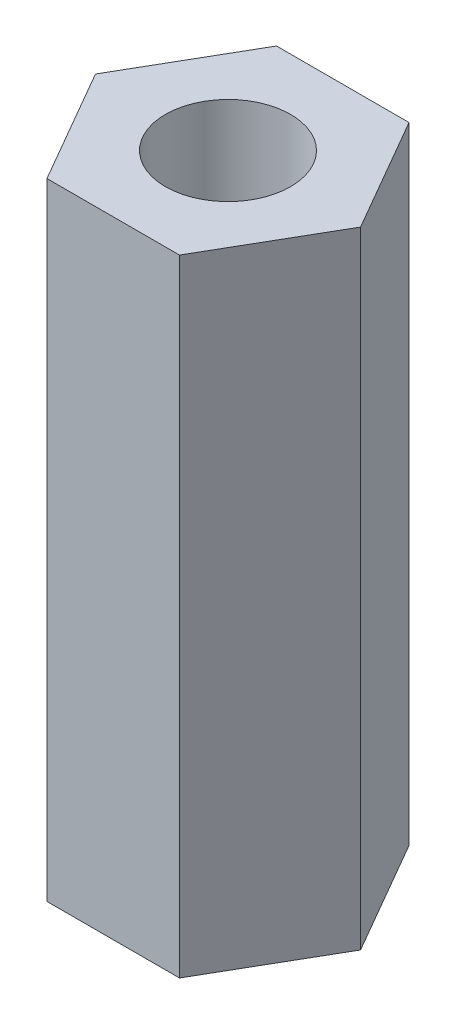
ISO-10303-21;
HEADER;
FILE_DESCRIPTION(('STEP AP214'),'2;1');
FILE_NAME('part.step','',(''),(''),'','','');
FILE_SCHEMA(('AUTOMOTIVE_DESIGN { 1 0 10303 214 1 1 1 1 }'));
ENDSEC;
DATA;
#1=APPLICATION_CONTEXT('core data for automotive mechanical design processes');
#2=APPLICATION_PROTOCOL_DEFINITION('international standard','automotive_design',2000,#1);
#3=PRODUCT_CONTEXT('',#1,'mechanical');
#4=PRODUCT('Part','Part','',(#3));
#5=PRODUCT_RELATED_PRODUCT_CATEGORY('part','',(#4));
#6=PRODUCT_DEFINITION_FORMATION('','',#4);
#7=PRODUCT_DEFINITION_CONTEXT('part definition',#1,'design');
#8=PRODUCT_DEFINITION('design','',#6,#7);
#9=PRODUCT_DEFINITION_SHAPE('','',#8);
#10=(LENGTH_UNIT() NAMED_UNIT(*) SI_UNIT(.MILLI.,.METRE.));
#11=(NAMED_UNIT(*) PLANE_ANGLE_UNIT() SI_UNIT($,.RADIAN.));
#12=(NAMED_UNIT(*) SI_UNIT($,.STERADIAN.) SOLID_ANGLE_UNIT());
#13=UNCERTAINTY_MEASURE_WITH_UNIT(LENGTH_MEASURE(1.E-05),#10,'distance_accuracy_value','');
#14=(GEOMETRIC_REPRESENTATION_CONTEXT(3) GLOBAL_UNCERTAINTY_ASSIGNED_CONTEXT((#13)) GLOBAL_UNIT_ASSIGNED_CONTEXT((#10,
#11,#12)) REPRESENTATION_CONTEXT('',''));
#15=CARTESIAN_POINT('',(0.,0.,0.));
#16=DIRECTION('',(0.,0.,1.));
#17=DIRECTION('',(1.,0.,0.));
#18=AXIS2_PLACEMENT_3D('',#15,#16,#17);
#19=CARTESIAN_POINT('',(1.5877132402715,15.,2.74999999999997));
#20=DIRECTION('',(-0.866025403784441,0.,-0.499999999999995));
#21=DIRECTION('',(-0.499999999999995,0.,0.866025403784442));
#22=AXIS2_PLACEMENT_3D('',#19,#20,#21);
#23=PLANE('',#22);
#24=DIRECTION('',(0.499999999999995,0.,-0.866025403784441));
#25=VECTOR('',#24,1.);
#26=CARTESIAN_POINT('',(1.5877132402715,0.,2.74999999999997));
#27=LINE('',#26,#25);
#28=CARTESIAN_POINT('',(1.5877132402715,0.,2.74999999999997));
#29=VERTEX_POINT('',#28);
#30=CARTESIAN_POINT('',(3.17542648054293,0.,0.));
#31=VERTEX_POINT('',#30);
#32=EDGE_CURVE('E117',#29,#31,#27,.T.);
#33=ORIENTED_EDGE('',*,*,#32,.T.);
#34=DIRECTION('',(0.,-1.,0.));
#35=VECTOR('',#34,1.);
#36=CARTESIAN_POINT('',(3.17542648054293,15.,0.));
#37=LINE('',#36,#35);
#38=CARTESIAN_POINT('',(3.17542648054293,15.,0.));
#39=VERTEX_POINT('',#38);
#40=EDGE_CURVE('E11',#39,#31,#37,.T.);
#41=ORIENTED_EDGE('',*,*,#40,.F.);
#42=DIRECTION('',(0.499999999999995,0.,-0.866025403784441));
#43=VECTOR('',#42,1.);
#44=CARTESIAN_POINT('',(1.5877132402715,15.,2.74999999999997));
#45=LINE('',#44,#43);
#46=CARTESIAN_POINT('',(1.5877132402715,15.,2.74999999999997));
#47=VERTEX_POINT('',#46);
#48=EDGE_CURVE('E128',#47,#39,#45,.T.);
#49=ORIENTED_EDGE('',*,*,#48,.F.);
#50=DIRECTION('',(0.,-1.,0.));
#51=VECTOR('',#50,1.);
#52=CARTESIAN_POINT('',(1.5877132402715,15.,2.74999999999997));
#53=LINE('',#52,#51);
#54=EDGE_CURVE('E113',#47,#29,#53,.T.);
#55=ORIENTED_EDGE('',*,*,#54,.T.);
#56=EDGE_LOOP('',(#33,#41,#49,#55));
#57=FACE_BOUND('',#56,.T.);
#58=ADVANCED_FACE('F33',(#57),#23,.F.);
#59=CARTESIAN_POINT('',(3.17542648054293,15.,0.));
#60=DIRECTION('',(-0.866025403784438,0.,0.500000000000001));
#61=DIRECTION('',(0.500000000000001,0.,0.866025403784438));
#62=AXIS2_PLACEMENT_3D('',#59,#60,#61);
#63=PLANE('',#62);
#64=DIRECTION('',(-0.500000000000001,0.,-0.866025403784438));
#65=VECTOR('',#64,1.);
#66=CARTESIAN_POINT('',(3.17542648054293,0.,0.));
#67=LINE('',#66,#65);
#68=CARTESIAN_POINT('',(1.58771324027146,0.,-2.74999999999999));
#69=VERTEX_POINT('',#68);
#70=EDGE_CURVE('E120',#31,#69,#67,.T.);
#71=ORIENTED_EDGE('',*,*,#70,.T.);
#72=DIRECTION('',(0.,-1.,0.));
#73=VECTOR('',#72,1.);
#74=CARTESIAN_POINT('',(1.58771324027146,15.,-2.74999999999999));
#75=LINE('',#74,#73);
#76=CARTESIAN_POINT('',(1.58771324027146,15.,-2.74999999999999));
#77=VERTEX_POINT('',#76);
#78=EDGE_CURVE('E41',#77,#69,#75,.T.);
#79=ORIENTED_EDGE('',*,*,#78,.F.);
#80=DIRECTION('',(-0.500000000000001,0.,-0.866025403784438));
#81=VECTOR('',#80,1.);
#82=CARTESIAN_POINT('',(3.17542648054293,15.,0.));
#83=LINE('',#82,#81);
#84=EDGE_CURVE('E86',#39,#77,#83,.T.);
#85=ORIENTED_EDGE('',*,*,#84,.F.);
#86=ORIENTED_EDGE('',*,*,#40,.T.);
#87=EDGE_LOOP('',(#71,#79,#85,#86));
#88=FACE_BOUND('',#87,.T.);
#89=ADVANCED_FACE('F153',(#88),#63,.F.);
#90=CARTESIAN_POINT('',(1.58771324027146,15.,-2.74999999999999));
#91=DIRECTION('',(0.,0.,1.));
#92=DIRECTION('',(1.,0.,0.));
#93=AXIS2_PLACEMENT_3D('',#90,#91,#92);
#94=PLANE('',#93);
#95=DIRECTION('',(-1.,0.,0.));
#96=VECTOR('',#95,1.);
#97=CARTESIAN_POINT('',(1.58771324027146,0.,-2.74999999999999));
#98=LINE('',#97,#96);
#99=CARTESIAN_POINT('',(-1.58771324027148,0.,-2.74999999999998));
#100=VERTEX_POINT('',#99);
#101=EDGE_CURVE('E123',#69,#100,#98,.T.);
#102=ORIENTED_EDGE('',*,*,#101,.T.);
#103=DIRECTION('',(0.,-1.,0.));
#104=VECTOR('',#103,1.);
#105=CARTESIAN_POINT('',(-1.58771324027148,15.,-2.74999999999998));
#106=LINE('',#105,#104);
#107=CARTESIAN_POINT('',(-1.58771324027148,15.,-2.74999999999998));
#108=VERTEX_POINT('',#107);
#109=EDGE_CURVE('E108',#108,#100,#106,.T.);
#110=ORIENTED_EDGE('',*,*,#109,.F.);
#111=DIRECTION('',(-1.,0.,0.));
#112=VECTOR('',#111,1.);
#113=CARTESIAN_POINT('',(1.58771324027146,15.,-2.74999999999999));
#114=LINE('',#113,#112);
#115=EDGE_CURVE('E99',#77,#108,#114,.T.);
#116=ORIENTED_EDGE('',*,*,#115,.F.);
#117=ORIENTED_EDGE('',*,*,#78,.T.);
#118=EDGE_LOOP('',(#102,#110,#116,#117));
#119=FACE_BOUND('',#118,.T.);
#120=ADVANCED_FACE('F134',(#119),#94,.F.);
#121=CARTESIAN_POINT('',(-1.58771324027148,15.,-2.74999999999998));
#122=DIRECTION('',(0.866025403784442,0.,0.499999999999995));
#123=DIRECTION('',(0.499999999999995,0.,-0.866025403784442));
#124=AXIS2_PLACEMENT_3D('',#121,#122,#123);
#125=PLANE('',#124);
#126=DIRECTION('',(-0.499999999999995,0.,0.866025403784442));
#127=VECTOR('',#126,1.);
#128=CARTESIAN_POINT('',(-1.58771324027148,0.,-2.74999999999998));
#129=LINE('',#128,#127);
#130=CARTESIAN_POINT('',(-3.17542648054293,0.,0.));
#131=VERTEX_POINT('',#130);
#132=EDGE_CURVE('E107',#100,#131,#129,.T.);
#133=ORIENTED_EDGE('',*,*,#132,.T.);
#134=DIRECTION('',(0.,-1.,0.));
#135=VECTOR('',#134,1.);
#136=CARTESIAN_POINT('',(-3.17542648054293,15.,0.));
#137=LINE('',#136,#135);
#138=CARTESIAN_POINT('',(-3.17542648054293,15.,0.));
#139=VERTEX_POINT('',#138);
#140=EDGE_CURVE('E104',#139,#131,#137,.T.);
#141=ORIENTED_EDGE('',*,*,#140,.F.);
#142=DIRECTION('',(-0.499999999999995,0.,0.866025403784442));
#143=VECTOR('',#142,1.);
#144=CARTESIAN_POINT('',(-1.58771324027148,15.,-2.74999999999998));
#145=LINE('',#144,#143);
#146=EDGE_CURVE('E93',#108,#139,#145,.T.);
#147=ORIENTED_EDGE('',*,*,#146,.F.);
#148=ORIENTED_EDGE('',*,*,#109,.T.);
#149=EDGE_LOOP('',(#133,#141,#147,#148));
#150=FACE_BOUND('',#149,.T.);
#151=ADVANCED_FACE('F105',(#150),#125,.F.);
#152=CARTESIAN_POINT('',(-3.17542648054293,15.,0.));
#153=DIRECTION('',(0.866025403784435,0.,-0.500000000000007));
#154=DIRECTION('',(-0.500000000000007,0.,-0.866025403784435));
#155=AXIS2_PLACEMENT_3D('',#152,#153,#154);
#156=PLANE('',#155);
#157=DIRECTION('',(0.500000000000007,0.,0.866025403784435));
#158=VECTOR('',#157,1.);
#159=CARTESIAN_POINT('',(-3.17542648054293,0.,0.));
#160=LINE('',#159,#158);
#161=CARTESIAN_POINT('',(-1.58771324027144,0.,2.75));
#162=VERTEX_POINT('',#161);
#163=EDGE_CURVE('E72',#131,#162,#160,.T.);
#164=ORIENTED_EDGE('',*,*,#163,.T.);
#165=DIRECTION('',(0.,-1.,0.));
#166=VECTOR('',#165,1.);
#167=CARTESIAN_POINT('',(-1.58771324027144,15.,2.75));
#168=LINE('',#167,#166);
#169=CARTESIAN_POINT('',(-1.58771324027144,15.,2.75));
#170=VERTEX_POINT('',#169);
#171=EDGE_CURVE('E109',#170,#162,#168,.T.);
#172=ORIENTED_EDGE('',*,*,#171,.F.);
#173=DIRECTION('',(0.500000000000007,0.,0.866025403784435));
#174=VECTOR('',#173,1.);
#175=CARTESIAN_POINT('',(-3.17542648054293,15.,0.));
#176=LINE('',#175,#174);
#177=EDGE_CURVE('E97',#139,#170,#176,.T.);
#178=ORIENTED_EDGE('',*,*,#177,.F.);
#179=ORIENTED_EDGE('',*,*,#140,.T.);
#180=EDGE_LOOP('',(#164,#172,#178,#179));
#181=FACE_BOUND('',#180,.T.);
#182=ADVANCED_FACE('F111',(#181),#156,.F.);
#183=CARTESIAN_POINT('',(-1.58771324027144,15.,2.75));
#184=DIRECTION('',(0.,0.,-1.));
#185=DIRECTION('',(-1.,0.,0.));
#186=AXIS2_PLACEMENT_3D('',#183,#184,#185);
#187=PLANE('',#186);
#188=DIRECTION('',(1.,0.,0.));
#189=VECTOR('',#188,1.);
#190=CARTESIAN_POINT('',(-1.58771324027144,0.,2.75));
#191=LINE('',#190,#189);
#192=EDGE_CURVE('E78',#162,#29,#191,.T.);
#193=ORIENTED_EDGE('',*,*,#192,.T.);
#194=ORIENTED_EDGE('',*,*,#54,.F.);
#195=DIRECTION('',(1.,0.,0.));
#196=VECTOR('',#195,1.);
#197=CARTESIAN_POINT('',(-1.58771324027144,15.,2.75));
#198=LINE('',#197,#196);
#199=EDGE_CURVE('E49',#170,#47,#198,.T.);
#200=ORIENTED_EDGE('',*,*,#199,.F.);
#201=ORIENTED_EDGE('',*,*,#171,.T.);
#202=EDGE_LOOP('',(#193,#194,#200,#201));
#203=FACE_BOUND('',#202,.T.);
#204=ADVANCED_FACE('F141',(#203),#187,.F.);
#205=CARTESIAN_POINT('',(0.,15.,0.));
#206=DIRECTION('',(0.,1.,0.));
#207=DIRECTION('',(0.,0.,1.));
#208=AXIS2_PLACEMENT_3D('',#205,#206,#207);
#209=PLANE('',#208);
#210=CARTESIAN_POINT('',(0.,15.,0.));
#211=DIRECTION('',(0.,1.,0.));
#212=DIRECTION('',(0.,0.,1.));
#213=AXIS2_PLACEMENT_3D('',#210,#211,#212);
#214=CIRCLE('',#213,1.5);
#215=CARTESIAN_POINT('',(0.,15.,1.5));
#216=VERTEX_POINT('',#215);
#217=EDGE_CURVE('E121',#216,#216,#214,.T.);
#218=ORIENTED_EDGE('',*,*,#217,.F.);
#219=EDGE_LOOP('',(#218));
#220=FACE_BOUND('',#219,.T.);
#221=ORIENTED_EDGE('',*,*,#48,.T.);
#222=ORIENTED_EDGE('',*,*,#84,.T.);
#223=ORIENTED_EDGE('',*,*,#115,.T.);
#224=ORIENTED_EDGE('',*,*,#146,.T.);
#225=ORIENTED_EDGE('',*,*,#177,.T.);
#226=ORIENTED_EDGE('',*,*,#199,.T.);
#227=EDGE_LOOP('',(#221,#222,#223,#224,#225,#226));
#228=FACE_BOUND('',#227,.T.);
#229=ADVANCED_FACE('F95',(#220,#228),#209,.T.);
#230=CARTESIAN_POINT('',(0.,0.,0.));
#231=DIRECTION('',(0.,1.,0.));
#232=DIRECTION('',(0.,0.,1.));
#233=AXIS2_PLACEMENT_3D('',#230,#231,#232);
#234=PLANE('',#233);
#235=CARTESIAN_POINT('',(0.,0.,0.));
#236=DIRECTION('',(0.,1.,0.));
#237=DIRECTION('',(0.,0.,1.));
#238=AXIS2_PLACEMENT_3D('',#235,#236,#237);
#239=CIRCLE('',#238,1.5);
#240=CARTESIAN_POINT('',(0.,0.,1.5));
#241=VERTEX_POINT('',#240);
#242=EDGE_CURVE('E209',#241,#241,#239,.T.);
#243=ORIENTED_EDGE('',*,*,#242,.T.);
#244=EDGE_LOOP('',(#243));
#245=FACE_BOUND('',#244,.T.);
#246=ORIENTED_EDGE('',*,*,#32,.F.);
#247=ORIENTED_EDGE('',*,*,#192,.F.);
#248=ORIENTED_EDGE('',*,*,#163,.F.);
#249=ORIENTED_EDGE('',*,*,#132,.F.);
#250=ORIENTED_EDGE('',*,*,#101,.F.);
#251=ORIENTED_EDGE('',*,*,#70,.F.);
#252=EDGE_LOOP('',(#246,#247,#248,#249,#250,#251));
#253=FACE_BOUND('',#252,.T.);
#254=ADVANCED_FACE('F137',(#245,#253),#234,.F.);
#255=CARTESIAN_POINT('',(0.,5.,0.));
#256=DIRECTION('',(0.,1.,0.));
#257=DIRECTION('',(0.,0.,1.));
#258=AXIS2_PLACEMENT_3D('',#255,#256,#257);
#259=CYLINDRICAL_SURFACE('',#258,1.5);
#260=ORIENTED_EDGE('',*,*,#242,.F.);
#261=EDGE_LOOP('',(#260));
#262=FACE_BOUND('',#261,.T.);
#263=ORIENTED_EDGE('',*,*,#217,.T.);
#264=EDGE_LOOP('',(#263));
#265=FACE_BOUND('',#264,.T.);
#266=ADVANCED_FACE('F190',(#262,#265),#259,.F.);
#267=CLOSED_SHELL('',(#58,#89,#120,#151,#182,#204,#229,#254,#266));
#268=MANIFOLD_SOLID_BREP('B2',#267);
#269=ADVANCED_BREP_SHAPE_REPRESENTATION('',(#18,#268),#14);
#270=SHAPE_DEFINITION_REPRESENTATION(#9,#269);
ENDSEC;
END-ISO-10303-21;
